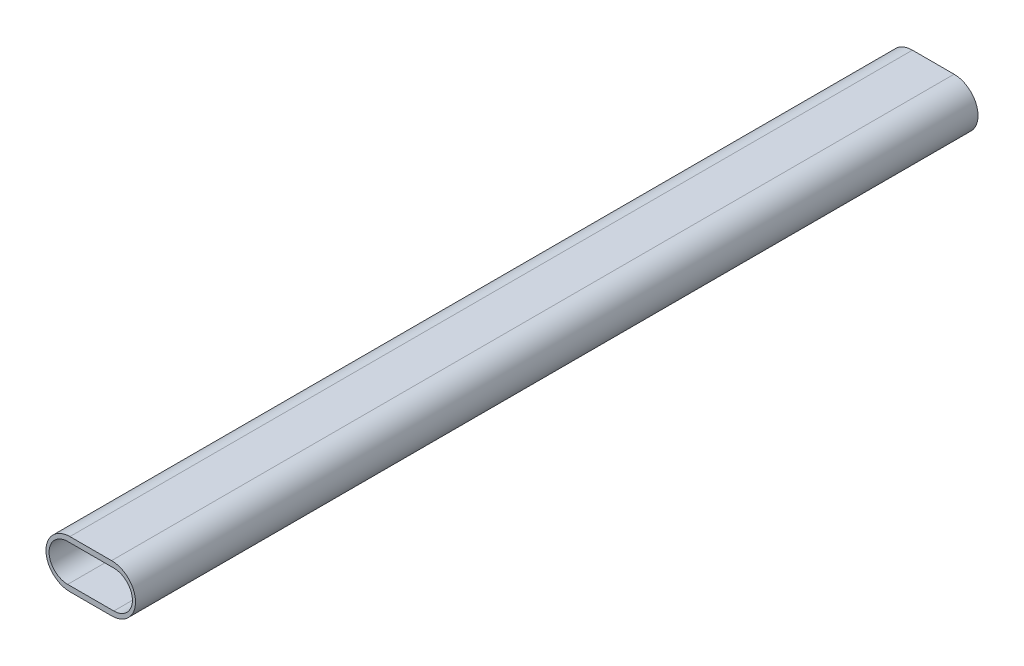
ISO-10303-21;
HEADER;
FILE_DESCRIPTION(('STEP AP214'),'2;1');
FILE_NAME('part.step','',(''),(''),'','','');
FILE_SCHEMA(('AUTOMOTIVE_DESIGN { 1 0 10303 214 1 1 1 1 }'));
ENDSEC;
DATA;
#1=APPLICATION_CONTEXT('core data for automotive mechanical design processes');
#2=APPLICATION_PROTOCOL_DEFINITION('international standard','automotive_design',2000,#1);
#3=PRODUCT_CONTEXT('',#1,'mechanical');
#4=PRODUCT('Part','Part','',(#3));
#5=PRODUCT_RELATED_PRODUCT_CATEGORY('part','',(#4));
#6=PRODUCT_DEFINITION_FORMATION('','',#4);
#7=PRODUCT_DEFINITION_CONTEXT('part definition',#1,'design');
#8=PRODUCT_DEFINITION('design','',#6,#7);
#9=PRODUCT_DEFINITION_SHAPE('','',#8);
#10=(LENGTH_UNIT() NAMED_UNIT(*) SI_UNIT(.MILLI.,.METRE.));
#11=(NAMED_UNIT(*) PLANE_ANGLE_UNIT() SI_UNIT($,.RADIAN.));
#12=(NAMED_UNIT(*) SI_UNIT($,.STERADIAN.) SOLID_ANGLE_UNIT());
#13=UNCERTAINTY_MEASURE_WITH_UNIT(LENGTH_MEASURE(1.E-05),#10,'distance_accuracy_value','');
#14=(GEOMETRIC_REPRESENTATION_CONTEXT(3) GLOBAL_UNCERTAINTY_ASSIGNED_CONTEXT((#13)) GLOBAL_UNIT_ASSIGNED_CONTEXT((#10,
#11,#12)) REPRESENTATION_CONTEXT('',''));
#15=CARTESIAN_POINT('',(0.,0.,0.));
#16=DIRECTION('',(0.,0.,1.));
#17=DIRECTION('',(1.,0.,0.));
#18=AXIS2_PLACEMENT_3D('',#15,#16,#17);
#19=CARTESIAN_POINT('',(-6.75,0.,273.05));
#20=DIRECTION('',(0.,0.,-1.));
#21=DIRECTION('',(-1.,0.,0.));
#22=AXIS2_PLACEMENT_3D('',#19,#20,#21);
#23=CYLINDRICAL_SURFACE('',#22,7.75);
#24=CARTESIAN_POINT('',(-6.75,0.,0.));
#25=DIRECTION('',(0.,0.,1.));
#26=DIRECTION('',(1.,0.,0.));
#27=AXIS2_PLACEMENT_3D('',#24,#25,#26);
#28=CIRCLE('',#27,7.75);
#29=CARTESIAN_POINT('',(-6.75,7.75,0.));
#30=VERTEX_POINT('',#29);
#31=CARTESIAN_POINT('',(-6.75,-7.75,0.));
#32=VERTEX_POINT('',#31);
#33=EDGE_CURVE('E151',#30,#32,#28,.T.);
#34=ORIENTED_EDGE('',*,*,#33,.T.);
#35=DIRECTION('',(0.,0.,-1.));
#36=VECTOR('',#35,1.);
#37=CARTESIAN_POINT('',(-6.75,-7.75,273.05));
#38=LINE('',#37,#36);
#39=CARTESIAN_POINT('',(-6.75,-7.75,273.05));
#40=VERTEX_POINT('',#39);
#41=EDGE_CURVE('E11',#40,#32,#38,.T.);
#42=ORIENTED_EDGE('',*,*,#41,.F.);
#43=CARTESIAN_POINT('',(-6.75,0.,273.05));
#44=DIRECTION('',(0.,0.,1.));
#45=DIRECTION('',(1.,0.,0.));
#46=AXIS2_PLACEMENT_3D('',#43,#44,#45);
#47=CIRCLE('',#46,7.75);
#48=CARTESIAN_POINT('',(-6.75,7.75,273.05));
#49=VERTEX_POINT('',#48);
#50=EDGE_CURVE('E160',#49,#40,#47,.T.);
#51=ORIENTED_EDGE('',*,*,#50,.F.);
#52=DIRECTION('',(0.,0.,-1.));
#53=VECTOR('',#52,1.);
#54=CARTESIAN_POINT('',(-6.75,7.75,273.05));
#55=LINE('',#54,#53);
#56=EDGE_CURVE('E141',#49,#30,#55,.T.);
#57=ORIENTED_EDGE('',*,*,#56,.T.);
#58=EDGE_LOOP('',(#34,#42,#51,#57));
#59=FACE_BOUND('',#58,.T.);
#60=ADVANCED_FACE('F45',(#59),#23,.T.);
#61=CARTESIAN_POINT('',(-6.75,-7.75,273.05));
#62=DIRECTION('',(0.,1.,0.));
#63=DIRECTION('',(-1.,0.,0.));
#64=AXIS2_PLACEMENT_3D('',#61,#62,#63);
#65=PLANE('',#64);
#66=DIRECTION('',(1.,0.,0.));
#67=VECTOR('',#66,1.);
#68=CARTESIAN_POINT('',(-6.75,-7.75,0.));
#69=LINE('',#68,#67);
#70=CARTESIAN_POINT('',(6.75,-7.75,0.));
#71=VERTEX_POINT('',#70);
#72=EDGE_CURVE('E101',#32,#71,#69,.T.);
#73=ORIENTED_EDGE('',*,*,#72,.T.);
#74=DIRECTION('',(0.,0.,-1.));
#75=VECTOR('',#74,1.);
#76=CARTESIAN_POINT('',(6.75,-7.75,273.05));
#77=LINE('',#76,#75);
#78=CARTESIAN_POINT('',(6.75,-7.75,273.05));
#79=VERTEX_POINT('',#78);
#80=EDGE_CURVE('E54',#79,#71,#77,.T.);
#81=ORIENTED_EDGE('',*,*,#80,.F.);
#82=DIRECTION('',(1.,0.,0.));
#83=VECTOR('',#82,1.);
#84=CARTESIAN_POINT('',(-6.75,-7.75,273.05));
#85=LINE('',#84,#83);
#86=EDGE_CURVE('E124',#40,#79,#85,.T.);
#87=ORIENTED_EDGE('',*,*,#86,.F.);
#88=ORIENTED_EDGE('',*,*,#41,.T.);
#89=EDGE_LOOP('',(#73,#81,#87,#88));
#90=FACE_BOUND('',#89,.T.);
#91=ADVANCED_FACE('F198',(#90),#65,.F.);
#92=CARTESIAN_POINT('',(6.75,0.,273.05));
#93=DIRECTION('',(0.,0.,-1.));
#94=DIRECTION('',(-1.,0.,0.));
#95=AXIS2_PLACEMENT_3D('',#92,#93,#94);
#96=CYLINDRICAL_SURFACE('',#95,7.75);
#97=CARTESIAN_POINT('',(6.75,0.,0.));
#98=DIRECTION('',(0.,0.,1.));
#99=DIRECTION('',(1.,0.,0.));
#100=AXIS2_PLACEMENT_3D('',#97,#98,#99);
#101=CIRCLE('',#100,7.75);
#102=CARTESIAN_POINT('',(6.75,7.75,0.));
#103=VERTEX_POINT('',#102);
#104=EDGE_CURVE('E109',#71,#103,#101,.T.);
#105=ORIENTED_EDGE('',*,*,#104,.T.);
#106=DIRECTION('',(0.,0.,-1.));
#107=VECTOR('',#106,1.);
#108=CARTESIAN_POINT('',(6.75,7.75,273.05));
#109=LINE('',#108,#107);
#110=CARTESIAN_POINT('',(6.75,7.75,273.05));
#111=VERTEX_POINT('',#110);
#112=EDGE_CURVE('E138',#111,#103,#109,.T.);
#113=ORIENTED_EDGE('',*,*,#112,.F.);
#114=CARTESIAN_POINT('',(6.75,0.,273.05));
#115=DIRECTION('',(0.,0.,1.));
#116=DIRECTION('',(1.,0.,0.));
#117=AXIS2_PLACEMENT_3D('',#114,#115,#116);
#118=CIRCLE('',#117,7.75);
#119=EDGE_CURVE('E132',#79,#111,#118,.T.);
#120=ORIENTED_EDGE('',*,*,#119,.F.);
#121=ORIENTED_EDGE('',*,*,#80,.T.);
#122=EDGE_LOOP('',(#105,#113,#120,#121));
#123=FACE_BOUND('',#122,.T.);
#124=ADVANCED_FACE('F139',(#123),#96,.T.);
#125=CARTESIAN_POINT('',(-6.75,7.75,273.05));
#126=DIRECTION('',(0.,-1.,0.));
#127=DIRECTION('',(1.,0.,0.));
#128=AXIS2_PLACEMENT_3D('',#125,#126,#127);
#129=PLANE('',#128);
#130=DIRECTION('',(-1.,0.,0.));
#131=VECTOR('',#130,1.);
#132=CARTESIAN_POINT('',(-6.75,7.75,0.));
#133=LINE('',#132,#131);
#134=EDGE_CURVE('E116',#103,#30,#133,.T.);
#135=ORIENTED_EDGE('',*,*,#134,.T.);
#136=ORIENTED_EDGE('',*,*,#56,.F.);
#137=DIRECTION('',(-1.,0.,0.));
#138=VECTOR('',#137,1.);
#139=CARTESIAN_POINT('',(-6.75,7.75,273.05));
#140=LINE('',#139,#138);
#141=EDGE_CURVE('E135',#111,#49,#140,.T.);
#142=ORIENTED_EDGE('',*,*,#141,.F.);
#143=ORIENTED_EDGE('',*,*,#112,.T.);
#144=EDGE_LOOP('',(#135,#136,#142,#143));
#145=FACE_BOUND('',#144,.T.);
#146=ADVANCED_FACE('F143',(#145),#129,.F.);
#147=CARTESIAN_POINT('',(-6.75,0.,273.05));
#148=DIRECTION('',(0.,0.,1.));
#149=DIRECTION('',(1.,0.,0.));
#150=AXIS2_PLACEMENT_3D('',#147,#148,#149);
#151=PLANE('',#150);
#152=CARTESIAN_POINT('',(-7.475,0.,273.05));
#153=DIRECTION('',(0.,0.,1.));
#154=DIRECTION('',(1.,0.,0.));
#155=AXIS2_PLACEMENT_3D('',#152,#153,#154);
#156=CIRCLE('',#155,6.025);
#157=CARTESIAN_POINT('',(-7.475,6.025,273.05));
#158=VERTEX_POINT('',#157);
#159=CARTESIAN_POINT('',(-7.475,-6.025,273.05));
#160=VERTEX_POINT('',#159);
#161=EDGE_CURVE('E48',#158,#160,#156,.T.);
#162=ORIENTED_EDGE('',*,*,#161,.F.);
#163=DIRECTION('',(-1.,0.,0.));
#164=VECTOR('',#163,1.);
#165=CARTESIAN_POINT('',(-7.475,6.025,273.05));
#166=LINE('',#165,#164);
#167=CARTESIAN_POINT('',(7.475,6.025,273.05));
#168=VERTEX_POINT('',#167);
#169=EDGE_CURVE('E92',#168,#158,#166,.T.);
#170=ORIENTED_EDGE('',*,*,#169,.F.);
#171=CARTESIAN_POINT('',(7.475,0.,273.05));
#172=DIRECTION('',(0.,0.,1.));
#173=DIRECTION('',(1.,0.,0.));
#174=AXIS2_PLACEMENT_3D('',#171,#172,#173);
#175=CIRCLE('',#174,6.025);
#176=CARTESIAN_POINT('',(7.475,-6.025,273.05));
#177=VERTEX_POINT('',#176);
#178=EDGE_CURVE('E167',#177,#168,#175,.T.);
#179=ORIENTED_EDGE('',*,*,#178,.F.);
#180=DIRECTION('',(1.,0.,0.));
#181=VECTOR('',#180,1.);
#182=CARTESIAN_POINT('',(-7.475,-6.025,273.05));
#183=LINE('',#182,#181);
#184=EDGE_CURVE('E164',#160,#177,#183,.T.);
#185=ORIENTED_EDGE('',*,*,#184,.F.);
#186=EDGE_LOOP('',(#162,#170,#179,#185));
#187=FACE_BOUND('',#186,.T.);
#188=ORIENTED_EDGE('',*,*,#50,.T.);
#189=ORIENTED_EDGE('',*,*,#86,.T.);
#190=ORIENTED_EDGE('',*,*,#119,.T.);
#191=ORIENTED_EDGE('',*,*,#141,.T.);
#192=EDGE_LOOP('',(#188,#189,#190,#191));
#193=FACE_BOUND('',#192,.T.);
#194=ADVANCED_FACE('F133',(#187,#193),#151,.T.);
#195=CARTESIAN_POINT('',(-6.75,0.,0.));
#196=DIRECTION('',(0.,0.,1.));
#197=DIRECTION('',(1.,0.,0.));
#198=AXIS2_PLACEMENT_3D('',#195,#196,#197);
#199=PLANE('',#198);
#200=DIRECTION('',(-1.,0.,0.));
#201=VECTOR('',#200,1.);
#202=CARTESIAN_POINT('',(-7.475,6.025,0.));
#203=LINE('',#202,#201);
#204=CARTESIAN_POINT('',(7.475,6.025,0.));
#205=VERTEX_POINT('',#204);
#206=CARTESIAN_POINT('',(-7.475,6.025,0.));
#207=VERTEX_POINT('',#206);
#208=EDGE_CURVE('E190',#205,#207,#203,.T.);
#209=ORIENTED_EDGE('',*,*,#208,.T.);
#210=CARTESIAN_POINT('',(-7.475,0.,0.));
#211=DIRECTION('',(0.,0.,1.));
#212=DIRECTION('',(1.,0.,0.));
#213=AXIS2_PLACEMENT_3D('',#210,#211,#212);
#214=CIRCLE('',#213,6.025);
#215=CARTESIAN_POINT('',(-7.475,-6.025,0.));
#216=VERTEX_POINT('',#215);
#217=EDGE_CURVE('E323',#207,#216,#214,.T.);
#218=ORIENTED_EDGE('',*,*,#217,.T.);
#219=DIRECTION('',(1.,0.,0.));
#220=VECTOR('',#219,1.);
#221=CARTESIAN_POINT('',(-7.475,-6.025,0.));
#222=LINE('',#221,#220);
#223=CARTESIAN_POINT('',(7.475,-6.025,0.));
#224=VERTEX_POINT('',#223);
#225=EDGE_CURVE('E328',#216,#224,#222,.T.);
#226=ORIENTED_EDGE('',*,*,#225,.T.);
#227=CARTESIAN_POINT('',(7.475,0.,0.));
#228=DIRECTION('',(0.,0.,1.));
#229=DIRECTION('',(1.,0.,0.));
#230=AXIS2_PLACEMENT_3D('',#227,#228,#229);
#231=CIRCLE('',#230,6.025);
#232=EDGE_CURVE('E71',#224,#205,#231,.T.);
#233=ORIENTED_EDGE('',*,*,#232,.T.);
#234=EDGE_LOOP('',(#209,#218,#226,#233));
#235=FACE_BOUND('',#234,.T.);
#236=ORIENTED_EDGE('',*,*,#33,.F.);
#237=ORIENTED_EDGE('',*,*,#134,.F.);
#238=ORIENTED_EDGE('',*,*,#104,.F.);
#239=ORIENTED_EDGE('',*,*,#72,.F.);
#240=EDGE_LOOP('',(#236,#237,#238,#239));
#241=FACE_BOUND('',#240,.T.);
#242=ADVANCED_FACE('F199',(#235,#241),#199,.F.);
#243=CARTESIAN_POINT('',(-7.475,0.,0.));
#244=DIRECTION('',(0.,0.,1.));
#245=DIRECTION('',(1.,0.,0.));
#246=AXIS2_PLACEMENT_3D('',#243,#244,#245);
#247=CYLINDRICAL_SURFACE('',#246,6.025);
#248=ORIENTED_EDGE('',*,*,#161,.T.);
#249=DIRECTION('',(0.,0.,1.));
#250=VECTOR('',#249,1.);
#251=CARTESIAN_POINT('',(-7.475,-6.025,0.));
#252=LINE('',#251,#250);
#253=EDGE_CURVE('E62',#216,#160,#252,.T.);
#254=ORIENTED_EDGE('',*,*,#253,.F.);
#255=ORIENTED_EDGE('',*,*,#217,.F.);
#256=DIRECTION('',(0.,0.,1.));
#257=VECTOR('',#256,1.);
#258=CARTESIAN_POINT('',(-7.475,6.025,0.));
#259=LINE('',#258,#257);
#260=EDGE_CURVE('E168',#207,#158,#259,.T.);
#261=ORIENTED_EDGE('',*,*,#260,.T.);
#262=EDGE_LOOP('',(#248,#254,#255,#261));
#263=FACE_BOUND('',#262,.T.);
#264=ADVANCED_FACE('F175',(#263),#247,.F.);
#265=CARTESIAN_POINT('',(-7.475,6.025,0.));
#266=DIRECTION('',(0.,1.,0.));
#267=DIRECTION('',(-1.,0.,0.));
#268=AXIS2_PLACEMENT_3D('',#265,#266,#267);
#269=PLANE('',#268);
#270=ORIENTED_EDGE('',*,*,#169,.T.);
#271=ORIENTED_EDGE('',*,*,#260,.F.);
#272=ORIENTED_EDGE('',*,*,#208,.F.);
#273=DIRECTION('',(0.,0.,1.));
#274=VECTOR('',#273,1.);
#275=CARTESIAN_POINT('',(7.475,6.025,0.));
#276=LINE('',#275,#274);
#277=EDGE_CURVE('E185',#205,#168,#276,.T.);
#278=ORIENTED_EDGE('',*,*,#277,.T.);
#279=EDGE_LOOP('',(#270,#271,#272,#278));
#280=FACE_BOUND('',#279,.T.);
#281=ADVANCED_FACE('F207',(#280),#269,.F.);
#282=CARTESIAN_POINT('',(7.475,0.,0.));
#283=DIRECTION('',(0.,0.,1.));
#284=DIRECTION('',(1.,0.,0.));
#285=AXIS2_PLACEMENT_3D('',#282,#283,#284);
#286=CYLINDRICAL_SURFACE('',#285,6.025);
#287=ORIENTED_EDGE('',*,*,#178,.T.);
#288=ORIENTED_EDGE('',*,*,#277,.F.);
#289=ORIENTED_EDGE('',*,*,#232,.F.);
#290=DIRECTION('',(0.,0.,1.));
#291=VECTOR('',#290,1.);
#292=CARTESIAN_POINT('',(7.475,-6.025,0.));
#293=LINE('',#292,#291);
#294=EDGE_CURVE('E181',#224,#177,#293,.T.);
#295=ORIENTED_EDGE('',*,*,#294,.T.);
#296=EDGE_LOOP('',(#287,#288,#289,#295));
#297=FACE_BOUND('',#296,.T.);
#298=ADVANCED_FACE('F183',(#297),#286,.F.);
#299=CARTESIAN_POINT('',(-7.475,-6.025,0.));
#300=DIRECTION('',(0.,-1.,0.));
#301=DIRECTION('',(1.,0.,0.));
#302=AXIS2_PLACEMENT_3D('',#299,#300,#301);
#303=PLANE('',#302);
#304=ORIENTED_EDGE('',*,*,#184,.T.);
#305=ORIENTED_EDGE('',*,*,#294,.F.);
#306=ORIENTED_EDGE('',*,*,#225,.F.);
#307=ORIENTED_EDGE('',*,*,#253,.T.);
#308=EDGE_LOOP('',(#304,#305,#306,#307));
#309=FACE_BOUND('',#308,.T.);
#310=ADVANCED_FACE('F180',(#309),#303,.F.);
#311=CLOSED_SHELL('',(#60,#91,#124,#146,#194,#242,#264,#281,#298,#310));
#312=MANIFOLD_SOLID_BREP('B2',#311);
#313=ADVANCED_BREP_SHAPE_REPRESENTATION('',(#18,#312),#14);
#314=SHAPE_DEFINITION_REPRESENTATION(#9,#313);
ENDSEC;
END-ISO-10303-21;
